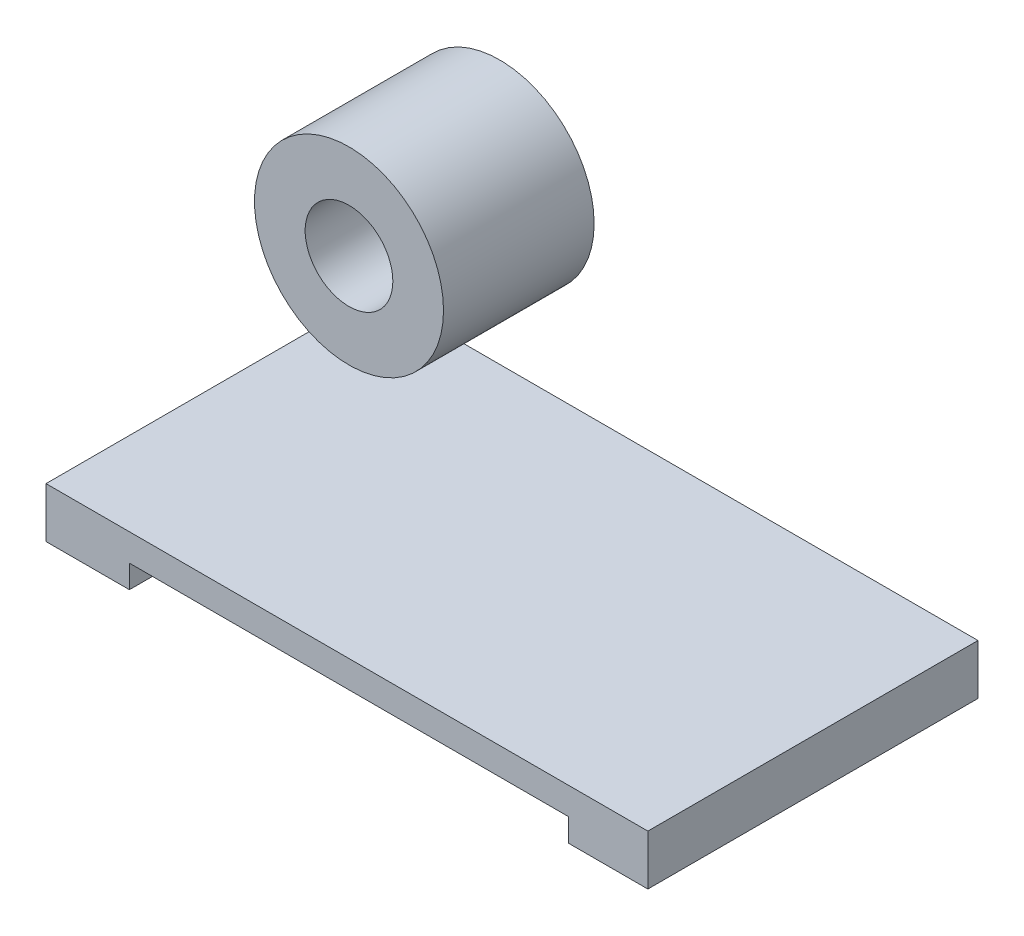
ISO-10303-21;
HEADER;
FILE_DESCRIPTION(('STEP AP214'),'2;1');
FILE_NAME('part.step','',(''),(''),'','','');
FILE_SCHEMA(('AUTOMOTIVE_DESIGN { 1 0 10303 214 1 1 1 1 }'));
ENDSEC;
DATA;
#1=APPLICATION_CONTEXT('core data for automotive mechanical design processes');
#2=APPLICATION_PROTOCOL_DEFINITION('international standard','automotive_design',2000,#1);
#3=PRODUCT_CONTEXT('',#1,'mechanical');
#4=PRODUCT('Part','Part','',(#3));
#5=PRODUCT_RELATED_PRODUCT_CATEGORY('part','',(#4));
#6=PRODUCT_DEFINITION_FORMATION('','',#4);
#7=PRODUCT_DEFINITION_CONTEXT('part definition',#1,'design');
#8=PRODUCT_DEFINITION('design','',#6,#7);
#9=PRODUCT_DEFINITION_SHAPE('','',#8);
#10=(LENGTH_UNIT() NAMED_UNIT(*) SI_UNIT(.MILLI.,.METRE.));
#11=(NAMED_UNIT(*) PLANE_ANGLE_UNIT() SI_UNIT($,.RADIAN.));
#12=(NAMED_UNIT(*) SI_UNIT($,.STERADIAN.) SOLID_ANGLE_UNIT());
#13=UNCERTAINTY_MEASURE_WITH_UNIT(LENGTH_MEASURE(1.E-05),#10,'distance_accuracy_value','');
#14=(GEOMETRIC_REPRESENTATION_CONTEXT(3) GLOBAL_UNCERTAINTY_ASSIGNED_CONTEXT((#13)) GLOBAL_UNIT_ASSIGNED_CONTEXT((#10,
#11,#12)) REPRESENTATION_CONTEXT('',''));
#15=CARTESIAN_POINT('',(0.,0.,0.));
#16=DIRECTION('',(0.,0.,1.));
#17=DIRECTION('',(1.,0.,0.));
#18=AXIS2_PLACEMENT_3D('',#15,#16,#17);
#19=CARTESIAN_POINT('',(60.3528617525692,79.452861529995,-30.));
#20=DIRECTION('',(0.,0.,1.));
#21=DIRECTION('',(1.,0.,0.));
#22=AXIS2_PLACEMENT_3D('',#19,#20,#21);
#23=CYLINDRICAL_SURFACE('',#22,18.8278878459873);
#24=CARTESIAN_POINT('',(60.3528617525692,79.452861529995,-30.));
#25=DIRECTION('',(0.,0.,1.));
#26=DIRECTION('',(1.,0.,0.));
#27=AXIS2_PLACEMENT_3D('',#24,#25,#26);
#28=CIRCLE('',#27,18.8278878459873);
#29=CARTESIAN_POINT('',(79.1807495985566,79.452861529995,-30.));
#30=VERTEX_POINT('',#29);
#31=EDGE_CURVE('E11',#30,#30,#28,.T.);
#32=ORIENTED_EDGE('',*,*,#31,.T.);
#33=EDGE_LOOP('',(#32));
#34=FACE_BOUND('',#33,.T.);
#35=CARTESIAN_POINT('',(60.3528617525692,79.452861529995,0.));
#36=DIRECTION('',(0.,0.,1.));
#37=DIRECTION('',(1.,0.,0.));
#38=AXIS2_PLACEMENT_3D('',#35,#36,#37);
#39=CIRCLE('',#38,18.8278878459873);
#40=CARTESIAN_POINT('',(79.1807495985566,79.452861529995,0.));
#41=VERTEX_POINT('',#40);
#42=EDGE_CURVE('E46',#41,#41,#39,.T.);
#43=ORIENTED_EDGE('',*,*,#42,.F.);
#44=EDGE_LOOP('',(#43));
#45=FACE_BOUND('',#44,.T.);
#46=ADVANCED_FACE('F43',(#34,#45),#23,.T.);
#47=CARTESIAN_POINT('',(60.3528617525692,79.452861529995,-30.));
#48=DIRECTION('',(0.,0.,1.));
#49=DIRECTION('',(1.,0.,0.));
#50=AXIS2_PLACEMENT_3D('',#47,#48,#49);
#51=PLANE('',#50);
#52=CARTESIAN_POINT('',(60.3528617525692,79.452861529995,-30.));
#53=DIRECTION('',(0.,0.,1.));
#54=DIRECTION('',(1.,0.,0.));
#55=AXIS2_PLACEMENT_3D('',#52,#53,#54);
#56=CIRCLE('',#55,8.73244656881579);
#57=CARTESIAN_POINT('',(69.085308321385,79.452861529995,-30.));
#58=VERTEX_POINT('',#57);
#59=EDGE_CURVE('E53',#58,#58,#56,.T.);
#60=ORIENTED_EDGE('',*,*,#59,.T.);
#61=EDGE_LOOP('',(#60));
#62=FACE_BOUND('',#61,.T.);
#63=ORIENTED_EDGE('',*,*,#31,.F.);
#64=EDGE_LOOP('',(#63));
#65=FACE_BOUND('',#64,.T.);
#66=ADVANCED_FACE('F61',(#62,#65),#51,.F.);
#67=CARTESIAN_POINT('',(60.3528617525692,79.452861529995,0.));
#68=DIRECTION('',(0.,0.,1.));
#69=DIRECTION('',(1.,0.,0.));
#70=AXIS2_PLACEMENT_3D('',#67,#68,#69);
#71=PLANE('',#70);
#72=CARTESIAN_POINT('',(60.3528617525692,79.452861529995,0.));
#73=DIRECTION('',(0.,0.,1.));
#74=DIRECTION('',(1.,0.,0.));
#75=AXIS2_PLACEMENT_3D('',#72,#73,#74);
#76=CIRCLE('',#75,8.73244656881579);
#77=CARTESIAN_POINT('',(69.085308321385,79.452861529995,0.));
#78=VERTEX_POINT('',#77);
#79=EDGE_CURVE('E55',#78,#78,#76,.T.);
#80=ORIENTED_EDGE('',*,*,#79,.F.);
#81=EDGE_LOOP('',(#80));
#82=FACE_BOUND('',#81,.T.);
#83=ORIENTED_EDGE('',*,*,#42,.T.);
#84=EDGE_LOOP('',(#83));
#85=FACE_BOUND('',#84,.T.);
#86=ADVANCED_FACE('F67',(#82,#85),#71,.T.);
#87=CARTESIAN_POINT('',(60.3528617525692,79.452861529995,-30.));
#88=DIRECTION('',(0.,0.,1.));
#89=DIRECTION('',(1.,0.,0.));
#90=AXIS2_PLACEMENT_3D('',#87,#88,#89);
#91=CYLINDRICAL_SURFACE('',#90,8.73244656881579);
#92=ORIENTED_EDGE('',*,*,#59,.F.);
#93=EDGE_LOOP('',(#92));
#94=FACE_BOUND('',#93,.T.);
#95=ORIENTED_EDGE('',*,*,#79,.T.);
#96=EDGE_LOOP('',(#95));
#97=FACE_BOUND('',#96,.T.);
#98=ADVANCED_FACE('F64',(#94,#97),#91,.F.);
#99=CLOSED_SHELL('',(#46,#66,#86,#98));
#100=MANIFOLD_SOLID_BREP('B2',#99);
#101=CARTESIAN_POINT('',(0.,0.,0.));
#102=DIRECTION('',(0.,-1.,0.));
#103=DIRECTION('',(0.,0.,-1.));
#104=AXIS2_PLACEMENT_3D('',#101,#102,#103);
#105=PLANE('',#104);
#106=DIRECTION('',(0.,0.,-1.));
#107=VECTOR('',#106,1.);
#108=CARTESIAN_POINT('',(16.6137136606855,0.,0.));
#109=LINE('',#108,#107);
#110=CARTESIAN_POINT('',(16.6137136606855,0.,0.));
#111=VERTEX_POINT('',#110);
#112=CARTESIAN_POINT('',(16.6137136606855,0.,-65.7569145175337));
#113=VERTEX_POINT('',#112);
#114=EDGE_CURVE('E112',#111,#113,#109,.T.);
#115=ORIENTED_EDGE('',*,*,#114,.F.);
#116=DIRECTION('',(1.,0.,0.));
#117=VECTOR('',#116,1.);
#118=CARTESIAN_POINT('',(0.,0.,0.));
#119=LINE('',#118,#117);
#120=CARTESIAN_POINT('',(0.,0.,0.));
#121=VERTEX_POINT('',#120);
#122=EDGE_CURVE('E216',#121,#111,#119,.T.);
#123=ORIENTED_EDGE('',*,*,#122,.F.);
#124=DIRECTION('',(0.,0.,1.));
#125=VECTOR('',#124,1.);
#126=CARTESIAN_POINT('',(0.,0.,0.));
#127=LINE('',#126,#125);
#128=CARTESIAN_POINT('',(0.,0.,-65.7569145175337));
#129=VERTEX_POINT('',#128);
#130=EDGE_CURVE('E204',#129,#121,#127,.T.);
#131=ORIENTED_EDGE('',*,*,#130,.F.);
#132=DIRECTION('',(-1.,0.,0.));
#133=VECTOR('',#132,1.);
#134=CARTESIAN_POINT('',(0.,0.,-65.7569145175337));
#135=LINE('',#134,#133);
#136=EDGE_CURVE('E149',#113,#129,#135,.T.);
#137=ORIENTED_EDGE('',*,*,#136,.F.);
#138=EDGE_LOOP('',(#115,#123,#131,#137));
#139=FACE_BOUND('',#138,.T.);
#140=ADVANCED_FACE('F104',(#139),#105,.T.);
#141=CARTESIAN_POINT('',(0.,10.,0.));
#142=DIRECTION('',(1.,0.,0.));
#143=DIRECTION('',(0.,0.,-1.));
#144=AXIS2_PLACEMENT_3D('',#141,#142,#143);
#145=PLANE('',#144);
#146=ORIENTED_EDGE('',*,*,#130,.T.);
#147=DIRECTION('',(0.,-1.,0.));
#148=VECTOR('',#147,1.);
#149=CARTESIAN_POINT('',(0.,10.,0.));
#150=LINE('',#149,#148);
#151=CARTESIAN_POINT('',(0.,10.,0.));
#152=VERTEX_POINT('',#151);
#153=EDGE_CURVE('E229',#152,#121,#150,.T.);
#154=ORIENTED_EDGE('',*,*,#153,.F.);
#155=DIRECTION('',(0.,0.,1.));
#156=VECTOR('',#155,1.);
#157=CARTESIAN_POINT('',(0.,10.,0.));
#158=LINE('',#157,#156);
#159=CARTESIAN_POINT('',(0.,10.,-65.7569145175337));
#160=VERTEX_POINT('',#159);
#161=EDGE_CURVE('E205',#160,#152,#158,.T.);
#162=ORIENTED_EDGE('',*,*,#161,.F.);
#163=DIRECTION('',(0.,-1.,0.));
#164=VECTOR('',#163,1.);
#165=CARTESIAN_POINT('',(0.,10.,-65.7569145175337));
#166=LINE('',#165,#164);
#167=EDGE_CURVE('E212',#160,#129,#166,.T.);
#168=ORIENTED_EDGE('',*,*,#167,.T.);
#169=EDGE_LOOP('',(#146,#154,#162,#168));
#170=FACE_BOUND('',#169,.T.);
#171=ADVANCED_FACE('F106',(#170),#145,.F.);
#172=CARTESIAN_POINT('',(0.,10.,0.));
#173=DIRECTION('',(0.,0.,-1.));
#174=DIRECTION('',(-1.,0.,0.));
#175=AXIS2_PLACEMENT_3D('',#172,#173,#174);
#176=PLANE('',#175);
#177=ORIENTED_EDGE('',*,*,#122,.T.);
#178=DIRECTION('',(0.,-1.,0.));
#179=VECTOR('',#178,1.);
#180=CARTESIAN_POINT('',(16.6137136606855,4.58930377378536,0.));
#181=LINE('',#180,#179);
#182=CARTESIAN_POINT('',(16.6137136606855,4.58930377378536,0.));
#183=VERTEX_POINT('',#182);
#184=EDGE_CURVE('E193',#183,#111,#181,.T.);
#185=ORIENTED_EDGE('',*,*,#184,.F.);
#186=DIRECTION('',(-1.,0.,0.));
#187=VECTOR('',#186,1.);
#188=CARTESIAN_POINT('',(16.6137136606855,4.58930377378536,0.));
#189=LINE('',#188,#187);
#190=CARTESIAN_POINT('',(104.092009844453,4.58930377378536,0.));
#191=VERTEX_POINT('',#190);
#192=EDGE_CURVE('E184',#191,#183,#189,.T.);
#193=ORIENTED_EDGE('',*,*,#192,.F.);
#194=DIRECTION('',(0.,1.,0.));
#195=VECTOR('',#194,1.);
#196=CARTESIAN_POINT('',(104.092009844453,4.58930377378536,0.));
#197=LINE('',#196,#195);
#198=CARTESIAN_POINT('',(104.092009844453,0.,0.));
#199=VERTEX_POINT('',#198);
#200=EDGE_CURVE('E189',#199,#191,#197,.T.);
#201=ORIENTED_EDGE('',*,*,#200,.F.);
#202=CARTESIAN_POINT('',(119.884331052709,0.,0.));
#203=VERTEX_POINT('',#202);
#204=EDGE_CURVE('E215',#199,#203,#119,.T.);
#205=ORIENTED_EDGE('',*,*,#204,.T.);
#206=DIRECTION('',(0.,-1.,0.));
#207=VECTOR('',#206,1.);
#208=CARTESIAN_POINT('',(119.884331052709,10.,0.));
#209=LINE('',#208,#207);
#210=CARTESIAN_POINT('',(119.884331052709,10.,0.));
#211=VERTEX_POINT('',#210);
#212=EDGE_CURVE('E226',#211,#203,#209,.T.);
#213=ORIENTED_EDGE('',*,*,#212,.F.);
#214=DIRECTION('',(1.,0.,0.));
#215=VECTOR('',#214,1.);
#216=CARTESIAN_POINT('',(0.,10.,0.));
#217=LINE('',#216,#215);
#218=EDGE_CURVE('E157',#152,#211,#217,.T.);
#219=ORIENTED_EDGE('',*,*,#218,.F.);
#220=ORIENTED_EDGE('',*,*,#153,.T.);
#221=EDGE_LOOP('',(#177,#185,#193,#201,#205,#213,#219,#220));
#222=FACE_BOUND('',#221,.T.);
#223=ADVANCED_FACE('F196',(#222),#176,.F.);
#224=CARTESIAN_POINT('',(119.884331052709,10.,0.));
#225=DIRECTION('',(-1.,0.,0.));
#226=DIRECTION('',(0.,0.,1.));
#227=AXIS2_PLACEMENT_3D('',#224,#225,#226);
#228=PLANE('',#227);
#229=DIRECTION('',(0.,0.,-1.));
#230=VECTOR('',#229,1.);
#231=CARTESIAN_POINT('',(119.884331052709,0.,0.));
#232=LINE('',#231,#230);
#233=CARTESIAN_POINT('',(119.884331052709,0.,-65.7569145175337));
#234=VERTEX_POINT('',#233);
#235=EDGE_CURVE('E218',#203,#234,#232,.T.);
#236=ORIENTED_EDGE('',*,*,#235,.T.);
#237=DIRECTION('',(0.,-1.,0.));
#238=VECTOR('',#237,1.);
#239=CARTESIAN_POINT('',(119.884331052709,10.,-65.7569145175337));
#240=LINE('',#239,#238);
#241=CARTESIAN_POINT('',(119.884331052709,10.,-65.7569145175337));
#242=VERTEX_POINT('',#241);
#243=EDGE_CURVE('E223',#242,#234,#240,.T.);
#244=ORIENTED_EDGE('',*,*,#243,.F.);
#245=DIRECTION('',(0.,0.,-1.));
#246=VECTOR('',#245,1.);
#247=CARTESIAN_POINT('',(119.884331052709,10.,0.));
#248=LINE('',#247,#246);
#249=EDGE_CURVE('E209',#211,#242,#248,.T.);
#250=ORIENTED_EDGE('',*,*,#249,.F.);
#251=ORIENTED_EDGE('',*,*,#212,.T.);
#252=EDGE_LOOP('',(#236,#244,#250,#251));
#253=FACE_BOUND('',#252,.T.);
#254=ADVANCED_FACE('F247',(#253),#228,.F.);
#255=CARTESIAN_POINT('',(0.,10.,-65.7569145175337));
#256=DIRECTION('',(0.,0.,1.));
#257=DIRECTION('',(1.,0.,0.));
#258=AXIS2_PLACEMENT_3D('',#255,#256,#257);
#259=PLANE('',#258);
#260=DIRECTION('',(-1.,0.,0.));
#261=VECTOR('',#260,1.);
#262=CARTESIAN_POINT('',(0.,4.58930377378536,-65.7569145175337));
#263=LINE('',#262,#261);
#264=CARTESIAN_POINT('',(104.092009844453,4.58930377378536,-65.7569145175337));
#265=VERTEX_POINT('',#264);
#266=CARTESIAN_POINT('',(16.6137136606855,4.58930377378536,-65.7569145175337));
#267=VERTEX_POINT('',#266);
#268=EDGE_CURVE('E41',#265,#267,#263,.T.);
#269=ORIENTED_EDGE('',*,*,#268,.T.);
#270=DIRECTION('',(0.,-1.,0.));
#271=VECTOR('',#270,1.);
#272=CARTESIAN_POINT('',(16.6137136606855,10.,-65.7569145175337));
#273=LINE('',#272,#271);
#274=EDGE_CURVE('E202',#267,#113,#273,.T.);
#275=ORIENTED_EDGE('',*,*,#274,.T.);
#276=ORIENTED_EDGE('',*,*,#136,.T.);
#277=ORIENTED_EDGE('',*,*,#167,.F.);
#278=DIRECTION('',(-1.,0.,0.));
#279=VECTOR('',#278,1.);
#280=CARTESIAN_POINT('',(0.,10.,-65.7569145175337));
#281=LINE('',#280,#279);
#282=EDGE_CURVE('E128',#242,#160,#281,.T.);
#283=ORIENTED_EDGE('',*,*,#282,.F.);
#284=ORIENTED_EDGE('',*,*,#243,.T.);
#285=CARTESIAN_POINT('',(104.092009844453,0.,-65.7569145175337));
#286=VERTEX_POINT('',#285);
#287=EDGE_CURVE('E207',#234,#286,#135,.T.);
#288=ORIENTED_EDGE('',*,*,#287,.T.);
#289=DIRECTION('',(0.,1.,0.));
#290=VECTOR('',#289,1.);
#291=CARTESIAN_POINT('',(104.092009844453,10.,-65.7569145175337));
#292=LINE('',#291,#290);
#293=EDGE_CURVE('E119',#286,#265,#292,.T.);
#294=ORIENTED_EDGE('',*,*,#293,.T.);
#295=EDGE_LOOP('',(#269,#275,#276,#277,#283,#284,#288,#294));
#296=FACE_BOUND('',#295,.T.);
#297=ADVANCED_FACE('F235',(#296),#259,.F.);
#298=CARTESIAN_POINT('',(0.,10.,0.));
#299=DIRECTION('',(0.,-1.,0.));
#300=DIRECTION('',(0.,0.,-1.));
#301=AXIS2_PLACEMENT_3D('',#298,#299,#300);
#302=PLANE('',#301);
#303=ORIENTED_EDGE('',*,*,#161,.T.);
#304=ORIENTED_EDGE('',*,*,#218,.T.);
#305=ORIENTED_EDGE('',*,*,#249,.T.);
#306=ORIENTED_EDGE('',*,*,#282,.T.);
#307=EDGE_LOOP('',(#303,#304,#305,#306));
#308=FACE_BOUND('',#307,.T.);
#309=ADVANCED_FACE('F248',(#308),#302,.F.);
#310=DIRECTION('',(0.,0.,1.));
#311=VECTOR('',#310,1.);
#312=CARTESIAN_POINT('',(104.092009844453,0.,0.));
#313=LINE('',#312,#311);
#314=EDGE_CURVE('E191',#286,#199,#313,.T.);
#315=ORIENTED_EDGE('',*,*,#314,.F.);
#316=ORIENTED_EDGE('',*,*,#287,.F.);
#317=ORIENTED_EDGE('',*,*,#235,.F.);
#318=ORIENTED_EDGE('',*,*,#204,.F.);
#319=EDGE_LOOP('',(#315,#316,#317,#318));
#320=FACE_BOUND('',#319,.T.);
#321=ADVANCED_FACE('F246',(#320),#105,.T.);
#322=CARTESIAN_POINT('',(16.6137136606855,4.58930377378536,-105.));
#323=DIRECTION('',(0.,1.,0.));
#324=DIRECTION('',(0.,0.,1.));
#325=AXIS2_PLACEMENT_3D('',#322,#323,#324);
#326=PLANE('',#325);
#327=DIRECTION('',(0.,0.,1.));
#328=VECTOR('',#327,1.);
#329=CARTESIAN_POINT('',(104.092009844453,4.58930377378536,-105.));
#330=LINE('',#329,#328);
#331=EDGE_CURVE('E179',#265,#191,#330,.T.);
#332=ORIENTED_EDGE('',*,*,#331,.T.);
#333=ORIENTED_EDGE('',*,*,#192,.T.);
#334=DIRECTION('',(0.,0.,1.));
#335=VECTOR('',#334,1.);
#336=CARTESIAN_POINT('',(16.6137136606855,4.58930377378536,-105.));
#337=LINE('',#336,#335);
#338=EDGE_CURVE('E186',#267,#183,#337,.T.);
#339=ORIENTED_EDGE('',*,*,#338,.F.);
#340=ORIENTED_EDGE('',*,*,#268,.F.);
#341=EDGE_LOOP('',(#332,#333,#339,#340));
#342=FACE_BOUND('',#341,.T.);
#343=ADVANCED_FACE('F181',(#342),#326,.F.);
#344=CARTESIAN_POINT('',(16.6137136606855,4.58930377378536,-105.));
#345=DIRECTION('',(-1.,0.,0.));
#346=DIRECTION('',(0.,0.,1.));
#347=AXIS2_PLACEMENT_3D('',#344,#345,#346);
#348=PLANE('',#347);
#349=ORIENTED_EDGE('',*,*,#338,.T.);
#350=ORIENTED_EDGE('',*,*,#184,.T.);
#351=ORIENTED_EDGE('',*,*,#114,.T.);
#352=ORIENTED_EDGE('',*,*,#274,.F.);
#353=EDGE_LOOP('',(#349,#350,#351,#352));
#354=FACE_BOUND('',#353,.T.);
#355=ADVANCED_FACE('F233',(#354),#348,.F.);
#356=CARTESIAN_POINT('',(104.092009844453,4.58930377378536,-105.));
#357=DIRECTION('',(1.,0.,0.));
#358=DIRECTION('',(0.,0.,-1.));
#359=AXIS2_PLACEMENT_3D('',#356,#357,#358);
#360=PLANE('',#359);
#361=ORIENTED_EDGE('',*,*,#314,.T.);
#362=ORIENTED_EDGE('',*,*,#200,.T.);
#363=ORIENTED_EDGE('',*,*,#331,.F.);
#364=ORIENTED_EDGE('',*,*,#293,.F.);
#365=EDGE_LOOP('',(#361,#362,#363,#364));
#366=FACE_BOUND('',#365,.T.);
#367=ADVANCED_FACE('F190',(#366),#360,.F.);
#368=CLOSED_SHELL('',(#140,#171,#223,#254,#297,#309,#321,#343,#355,#367));
#369=MANIFOLD_SOLID_BREP('B6',#368);
#370=ADVANCED_BREP_SHAPE_REPRESENTATION('',(#18,#100,#369),#14);
#371=SHAPE_DEFINITION_REPRESENTATION(#9,#370);
ENDSEC;
END-ISO-10303-21;
